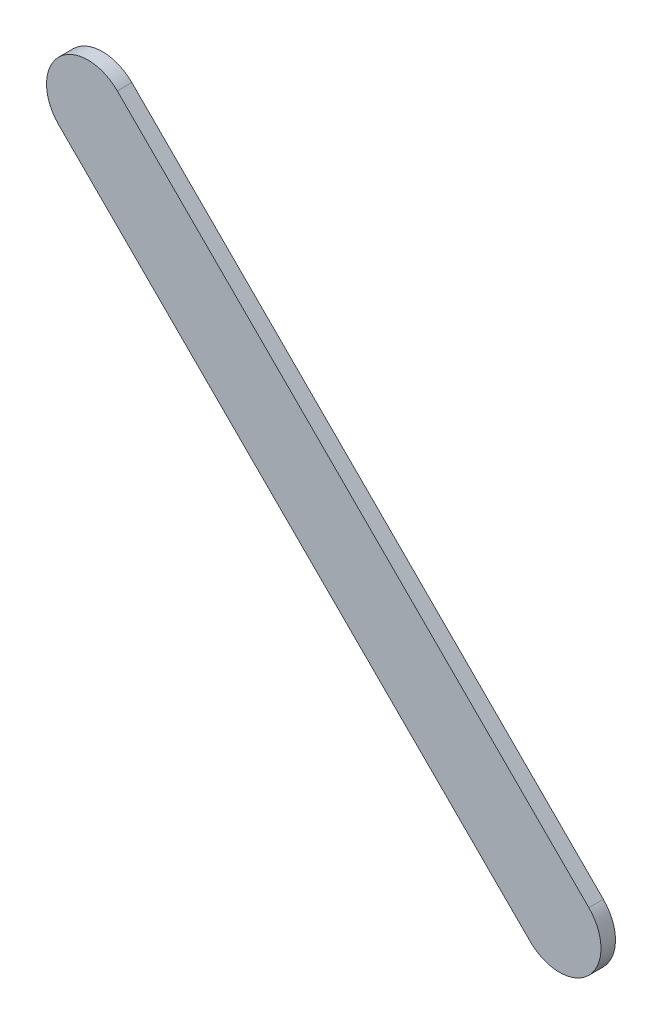
ISO-10303-21;
HEADER;
FILE_DESCRIPTION(('STEP AP214'),'2;1');
FILE_NAME('part.step','',(''),(''),'','','');
FILE_SCHEMA(('AUTOMOTIVE_DESIGN { 1 0 10303 214 1 1 1 1 }'));
ENDSEC;
DATA;
#1=APPLICATION_CONTEXT('core data for automotive mechanical design processes');
#2=APPLICATION_PROTOCOL_DEFINITION('international standard','automotive_design',2000,#1);
#3=PRODUCT_CONTEXT('',#1,'mechanical');
#4=PRODUCT('Part','Part','',(#3));
#5=PRODUCT_RELATED_PRODUCT_CATEGORY('part','',(#4));
#6=PRODUCT_DEFINITION_FORMATION('','',#4);
#7=PRODUCT_DEFINITION_CONTEXT('part definition',#1,'design');
#8=PRODUCT_DEFINITION('design','',#6,#7);
#9=PRODUCT_DEFINITION_SHAPE('','',#8);
#10=(LENGTH_UNIT() NAMED_UNIT(*) SI_UNIT(.MILLI.,.METRE.));
#11=(NAMED_UNIT(*) PLANE_ANGLE_UNIT() SI_UNIT($,.RADIAN.));
#12=(NAMED_UNIT(*) SI_UNIT($,.STERADIAN.) SOLID_ANGLE_UNIT());
#13=UNCERTAINTY_MEASURE_WITH_UNIT(LENGTH_MEASURE(1.E-05),#10,'distance_accuracy_value','');
#14=(GEOMETRIC_REPRESENTATION_CONTEXT(3) GLOBAL_UNCERTAINTY_ASSIGNED_CONTEXT((#13)) GLOBAL_UNIT_ASSIGNED_CONTEXT((#10,
#11,#12)) REPRESENTATION_CONTEXT('',''));
#15=CARTESIAN_POINT('',(0.,0.,0.));
#16=DIRECTION('',(0.,0.,1.));
#17=DIRECTION('',(1.,0.,0.));
#18=AXIS2_PLACEMENT_3D('',#15,#16,#17);
#19=CARTESIAN_POINT('',(88.529289,-124.53137,1.635));
#20=DIRECTION('',(0.,0.,1.));
#21=DIRECTION('',(1.,0.,0.));
#22=AXIS2_PLACEMENT_3D('',#19,#20,#21);
#23=PLANE('',#22);
#24=DIRECTION('',(0.707106781186548,-0.707106781186548,0.));
#25=VECTOR('',#24,1.);
#26=CARTESIAN_POINT('',(88.529289,-124.53137,1.635));
#27=LINE('',#26,#25);
#28=CARTESIAN_POINT('',(88.529289,-124.53137,1.635));
#29=VERTEX_POINT('',#28);
#30=CARTESIAN_POINT('',(89.666547,-125.668628,1.635));
#31=VERTEX_POINT('',#30);
#32=EDGE_CURVE('E81',#29,#31,#27,.T.);
#33=ORIENTED_EDGE('',*,*,#32,.T.);
#34=CARTESIAN_POINT('',(89.7372575,-125.5979175,1.635));
#35=DIRECTION('',(0.,0.,1.));
#36=DIRECTION('',(-0.707106781186548,-0.707106781186548,0.));
#37=AXIS2_PLACEMENT_3D('',#34,#35,#36);
#38=CIRCLE('',#37,0.09999974810219);
#39=CARTESIAN_POINT('',(89.807968,-125.527207,1.635));
#40=VERTEX_POINT('',#39);
#41=EDGE_CURVE('E105',#31,#40,#38,.T.);
#42=ORIENTED_EDGE('',*,*,#41,.T.);
#43=DIRECTION('',(-0.707106781186548,0.707106781186548,0.));
#44=VECTOR('',#43,1.);
#45=CARTESIAN_POINT('',(89.807968,-125.527207,1.635));
#46=LINE('',#45,#44);
#47=CARTESIAN_POINT('',(88.67071,-124.389949,1.635));
#48=VERTEX_POINT('',#47);
#49=EDGE_CURVE('E73',#40,#48,#46,.T.);
#50=ORIENTED_EDGE('',*,*,#49,.T.);
#51=CARTESIAN_POINT('',(88.5999995,-124.4606595,1.635));
#52=DIRECTION('',(0.,0.,1.));
#53=DIRECTION('',(0.707106781187048,0.707106781186048,0.));
#54=AXIS2_PLACEMENT_3D('',#51,#52,#53);
#55=CIRCLE('',#54,0.09999974810218);
#56=EDGE_CURVE('E11',#48,#29,#55,.T.);
#57=ORIENTED_EDGE('',*,*,#56,.T.);
#58=EDGE_LOOP('',(#33,#42,#50,#57));
#59=FACE_BOUND('',#58,.T.);
#60=ADVANCED_FACE('F17',(#59),#23,.T.);
#61=CARTESIAN_POINT('',(88.529289,-124.53137,1.6));
#62=DIRECTION('',(0.,0.,1.));
#63=DIRECTION('',(1.,0.,0.));
#64=AXIS2_PLACEMENT_3D('',#61,#62,#63);
#65=PLANE('',#64);
#66=CARTESIAN_POINT('',(88.5999995,-124.4606595,1.6));
#67=DIRECTION('',(0.,0.,1.));
#68=DIRECTION('',(0.707106781187048,0.707106781186048,0.));
#69=AXIS2_PLACEMENT_3D('',#66,#67,#68);
#70=CIRCLE('',#69,0.09999974810218);
#71=CARTESIAN_POINT('',(88.67071,-124.389949,1.6));
#72=VERTEX_POINT('',#71);
#73=CARTESIAN_POINT('',(88.529289,-124.53137,1.6));
#74=VERTEX_POINT('',#73);
#75=EDGE_CURVE('E25',#72,#74,#70,.T.);
#76=ORIENTED_EDGE('',*,*,#75,.F.);
#77=DIRECTION('',(-0.707106781186548,0.707106781186548,0.));
#78=VECTOR('',#77,1.);
#79=CARTESIAN_POINT('',(89.807968,-125.527207,1.6));
#80=LINE('',#79,#78);
#81=CARTESIAN_POINT('',(89.807968,-125.527207,1.6));
#82=VERTEX_POINT('',#81);
#83=EDGE_CURVE('E109',#82,#72,#80,.T.);
#84=ORIENTED_EDGE('',*,*,#83,.F.);
#85=CARTESIAN_POINT('',(89.7372575,-125.5979175,1.6));
#86=DIRECTION('',(0.,0.,1.));
#87=DIRECTION('',(-0.707106781186548,-0.707106781186548,0.));
#88=AXIS2_PLACEMENT_3D('',#85,#86,#87);
#89=CIRCLE('',#88,0.09999974810219);
#90=CARTESIAN_POINT('',(89.666547,-125.668628,1.6));
#91=VERTEX_POINT('',#90);
#92=EDGE_CURVE('E83',#91,#82,#89,.T.);
#93=ORIENTED_EDGE('',*,*,#92,.F.);
#94=DIRECTION('',(0.707106781186548,-0.707106781186548,0.));
#95=VECTOR('',#94,1.);
#96=CARTESIAN_POINT('',(88.529289,-124.53137,1.6));
#97=LINE('',#96,#95);
#98=EDGE_CURVE('E79',#74,#91,#97,.T.);
#99=ORIENTED_EDGE('',*,*,#98,.F.);
#100=EDGE_LOOP('',(#76,#84,#93,#99));
#101=FACE_BOUND('',#100,.T.);
#102=ADVANCED_FACE('F85',(#101),#65,.F.);
#103=CARTESIAN_POINT('',(88.5999995,-124.4606595,1.6));
#104=DIRECTION('',(0.,0.,-1.));
#105=DIRECTION('',(0.707106781187048,0.707106781186048,0.));
#106=AXIS2_PLACEMENT_3D('',#103,#104,#105);
#107=CYLINDRICAL_SURFACE('',#106,0.09999974810218);
#108=ORIENTED_EDGE('',*,*,#75,.T.);
#109=DIRECTION('',(0.,0.,1.));
#110=VECTOR('',#109,1.);
#111=CARTESIAN_POINT('',(88.529289,-124.53137,1.6));
#112=LINE('',#111,#110);
#113=EDGE_CURVE('E67',#74,#29,#112,.T.);
#114=ORIENTED_EDGE('',*,*,#113,.T.);
#115=ORIENTED_EDGE('',*,*,#56,.F.);
#116=DIRECTION('',(0.,0.,1.));
#117=VECTOR('',#116,1.);
#118=CARTESIAN_POINT('',(88.67071,-124.389949,1.6));
#119=LINE('',#118,#117);
#120=EDGE_CURVE('E70',#72,#48,#119,.T.);
#121=ORIENTED_EDGE('',*,*,#120,.F.);
#122=EDGE_LOOP('',(#108,#114,#115,#121));
#123=FACE_BOUND('',#122,.T.);
#124=ADVANCED_FACE('F66',(#123),#107,.T.);
#125=CARTESIAN_POINT('',(89.807968,-125.527207,1.6));
#126=DIRECTION('',(-0.707106781186548,-0.707106781186548,0.));
#127=DIRECTION('',(-0.707106781186548,0.707106781186548,0.));
#128=AXIS2_PLACEMENT_3D('',#125,#126,#127);
#129=PLANE('',#128);
#130=ORIENTED_EDGE('',*,*,#83,.T.);
#131=ORIENTED_EDGE('',*,*,#120,.T.);
#132=ORIENTED_EDGE('',*,*,#49,.F.);
#133=DIRECTION('',(0.,0.,1.));
#134=VECTOR('',#133,1.);
#135=CARTESIAN_POINT('',(89.807968,-125.527207,1.6));
#136=LINE('',#135,#134);
#137=EDGE_CURVE('E101',#82,#40,#136,.T.);
#138=ORIENTED_EDGE('',*,*,#137,.F.);
#139=EDGE_LOOP('',(#130,#131,#132,#138));
#140=FACE_BOUND('',#139,.T.);
#141=ADVANCED_FACE('F119',(#140),#129,.F.);
#142=CARTESIAN_POINT('',(89.7372575,-125.5979175,1.6));
#143=DIRECTION('',(0.,0.,-1.));
#144=DIRECTION('',(-0.707106781186548,-0.707106781186548,0.));
#145=AXIS2_PLACEMENT_3D('',#142,#143,#144);
#146=CYLINDRICAL_SURFACE('',#145,0.09999974810219);
#147=ORIENTED_EDGE('',*,*,#92,.T.);
#148=ORIENTED_EDGE('',*,*,#137,.T.);
#149=ORIENTED_EDGE('',*,*,#41,.F.);
#150=DIRECTION('',(0.,0.,1.));
#151=VECTOR('',#150,1.);
#152=CARTESIAN_POINT('',(89.666547,-125.668628,1.6));
#153=LINE('',#152,#151);
#154=EDGE_CURVE('E89',#91,#31,#153,.T.);
#155=ORIENTED_EDGE('',*,*,#154,.F.);
#156=EDGE_LOOP('',(#147,#148,#149,#155));
#157=FACE_BOUND('',#156,.T.);
#158=ADVANCED_FACE('F121',(#157),#146,.T.);
#159=CARTESIAN_POINT('',(88.529289,-124.53137,1.6));
#160=DIRECTION('',(0.707106781186548,0.707106781186548,0.));
#161=DIRECTION('',(0.,0.,-1.));
#162=AXIS2_PLACEMENT_3D('',#159,#160,#161);
#163=PLANE('',#162);
#164=ORIENTED_EDGE('',*,*,#98,.T.);
#165=ORIENTED_EDGE('',*,*,#154,.T.);
#166=ORIENTED_EDGE('',*,*,#32,.F.);
#167=ORIENTED_EDGE('',*,*,#113,.F.);
#168=EDGE_LOOP('',(#164,#165,#166,#167));
#169=FACE_BOUND('',#168,.T.);
#170=ADVANCED_FACE('F77',(#169),#163,.F.);
#171=CLOSED_SHELL('',(#60,#102,#124,#141,#158,#170));
#172=MANIFOLD_SOLID_BREP('B1',#171);
#173=ADVANCED_BREP_SHAPE_REPRESENTATION('',(#18,#172),#14);
#174=SHAPE_DEFINITION_REPRESENTATION(#9,#173);
ENDSEC;
END-ISO-10303-21;
